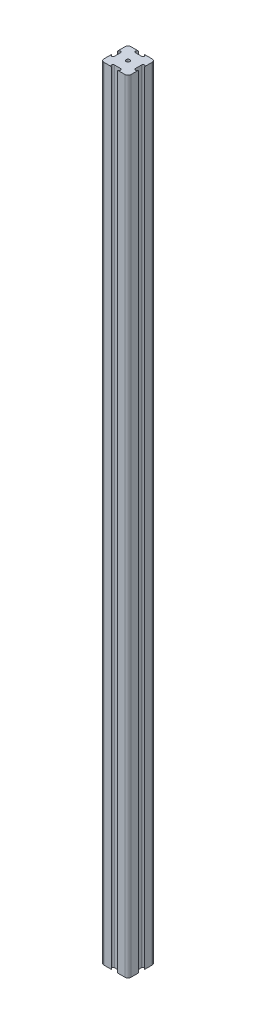
ISO-10303-21;
HEADER;
FILE_DESCRIPTION(('STEP AP214'),'2;1');
FILE_NAME('part.step','',(''),(''),'','','');
FILE_SCHEMA(('AUTOMOTIVE_DESIGN { 1 0 10303 214 1 1 1 1 }'));
ENDSEC;
DATA;
#1=APPLICATION_CONTEXT('core data for automotive mechanical design processes');
#2=APPLICATION_PROTOCOL_DEFINITION('international standard','automotive_design',2000,#1);
#3=PRODUCT_CONTEXT('',#1,'mechanical');
#4=PRODUCT('Part','Part','',(#3));
#5=PRODUCT_RELATED_PRODUCT_CATEGORY('part','',(#4));
#6=PRODUCT_DEFINITION_FORMATION('','',#4);
#7=PRODUCT_DEFINITION_CONTEXT('part definition',#1,'design');
#8=PRODUCT_DEFINITION('design','',#6,#7);
#9=PRODUCT_DEFINITION_SHAPE('','',#8);
#10=(LENGTH_UNIT() NAMED_UNIT(*) SI_UNIT(.MILLI.,.METRE.));
#11=(NAMED_UNIT(*) PLANE_ANGLE_UNIT() SI_UNIT($,.RADIAN.));
#12=(NAMED_UNIT(*) SI_UNIT($,.STERADIAN.) SOLID_ANGLE_UNIT());
#13=UNCERTAINTY_MEASURE_WITH_UNIT(LENGTH_MEASURE(1.E-05),#10,'distance_accuracy_value','');
#14=(GEOMETRIC_REPRESENTATION_CONTEXT(3) GLOBAL_UNCERTAINTY_ASSIGNED_CONTEXT((#13)) GLOBAL_UNIT_ASSIGNED_CONTEXT((#10,
#11,#12)) REPRESENTATION_CONTEXT('',''));
#15=CARTESIAN_POINT('',(0.,0.,0.));
#16=DIRECTION('',(0.,0.,1.));
#17=DIRECTION('',(1.,0.,0.));
#18=AXIS2_PLACEMENT_3D('',#15,#16,#17);
#19=CARTESIAN_POINT('',(-20.,1300.,5.));
#20=DIRECTION('',(0.,-1.,0.));
#21=DIRECTION('',(0.,0.,-1.));
#22=AXIS2_PLACEMENT_3D('',#19,#20,#21);
#23=CYLINDRICAL_SURFACE('',#22,2.5);
#24=CARTESIAN_POINT('',(-20.,0.,5.));
#25=DIRECTION('',(0.,-1.,0.));
#26=DIRECTION('',(0.,0.,-1.));
#27=AXIS2_PLACEMENT_3D('',#24,#25,#26);
#28=CIRCLE('',#27,2.5);
#29=CARTESIAN_POINT('',(-17.5,0.,5.));
#30=VERTEX_POINT('',#29);
#31=CARTESIAN_POINT('',(-22.5,0.,5.));
#32=VERTEX_POINT('',#31);
#33=EDGE_CURVE('E225',#30,#32,#28,.T.);
#34=ORIENTED_EDGE('',*,*,#33,.T.);
#35=DIRECTION('',(0.,-1.,0.));
#36=VECTOR('',#35,1.);
#37=CARTESIAN_POINT('',(-22.5,1300.,5.));
#38=LINE('',#37,#36);
#39=CARTESIAN_POINT('',(-22.5,1300.,5.));
#40=VERTEX_POINT('',#39);
#41=EDGE_CURVE('E11',#40,#32,#38,.T.);
#42=ORIENTED_EDGE('',*,*,#41,.F.);
#43=CARTESIAN_POINT('',(-20.,1300.,5.));
#44=DIRECTION('',(0.,-1.,0.));
#45=DIRECTION('',(0.,0.,-1.));
#46=AXIS2_PLACEMENT_3D('',#43,#44,#45);
#47=CIRCLE('',#46,2.5);
#48=CARTESIAN_POINT('',(-17.5,1300.,5.));
#49=VERTEX_POINT('',#48);
#50=EDGE_CURVE('E290',#49,#40,#47,.T.);
#51=ORIENTED_EDGE('',*,*,#50,.F.);
#52=DIRECTION('',(0.,-1.,0.));
#53=VECTOR('',#52,1.);
#54=CARTESIAN_POINT('',(-17.5,1300.,5.));
#55=LINE('',#54,#53);
#56=EDGE_CURVE('E221',#49,#30,#55,.T.);
#57=ORIENTED_EDGE('',*,*,#56,.T.);
#58=EDGE_LOOP('',(#34,#42,#51,#57));
#59=FACE_BOUND('',#58,.T.);
#60=ADVANCED_FACE('F33',(#59),#23,.F.);
#61=CARTESIAN_POINT('',(-22.5,1300.,5.));
#62=DIRECTION('',(1.,0.,0.));
#63=DIRECTION('',(0.,0.,-1.));
#64=AXIS2_PLACEMENT_3D('',#61,#62,#63);
#65=PLANE('',#64);
#66=DIRECTION('',(0.,0.,1.));
#67=VECTOR('',#66,1.);
#68=CARTESIAN_POINT('',(-22.5,0.,5.));
#69=LINE('',#68,#67);
#70=CARTESIAN_POINT('',(-22.5,0.,17.4999999999999));
#71=VERTEX_POINT('',#70);
#72=EDGE_CURVE('E228',#32,#71,#69,.T.);
#73=ORIENTED_EDGE('',*,*,#72,.T.);
#74=DIRECTION('',(0.,-1.,0.));
#75=VECTOR('',#74,1.);
#76=CARTESIAN_POINT('',(-22.5,1300.,17.4999999999999));
#77=LINE('',#76,#75);
#78=CARTESIAN_POINT('',(-22.5,1300.,17.4999999999999));
#79=VERTEX_POINT('',#78);
#80=EDGE_CURVE('E41',#79,#71,#77,.T.);
#81=ORIENTED_EDGE('',*,*,#80,.F.);
#82=DIRECTION('',(0.,0.,1.));
#83=VECTOR('',#82,1.);
#84=CARTESIAN_POINT('',(-22.5,1300.,5.));
#85=LINE('',#84,#83);
#86=EDGE_CURVE('E136',#40,#79,#85,.T.);
#87=ORIENTED_EDGE('',*,*,#86,.F.);
#88=ORIENTED_EDGE('',*,*,#41,.T.);
#89=EDGE_LOOP('',(#73,#81,#87,#88));
#90=FACE_BOUND('',#89,.T.);
#91=ADVANCED_FACE('F417',(#90),#65,.F.);
#92=CARTESIAN_POINT('',(-17.5,1300.,17.5));
#93=DIRECTION('',(0.,-1.,0.));
#94=DIRECTION('',(0.,0.,-1.));
#95=AXIS2_PLACEMENT_3D('',#92,#93,#94);
#96=CYLINDRICAL_SURFACE('',#95,5.);
#97=CARTESIAN_POINT('',(-17.5,0.,17.5));
#98=DIRECTION('',(0.,1.,0.));
#99=DIRECTION('',(0.,0.,1.));
#100=AXIS2_PLACEMENT_3D('',#97,#98,#99);
#101=CIRCLE('',#100,5.);
#102=CARTESIAN_POINT('',(-17.5,0.,22.5));
#103=VERTEX_POINT('',#102);
#104=EDGE_CURVE('E231',#71,#103,#101,.T.);
#105=ORIENTED_EDGE('',*,*,#104,.T.);
#106=DIRECTION('',(0.,-1.,0.));
#107=VECTOR('',#106,1.);
#108=CARTESIAN_POINT('',(-17.5,1300.,22.5));
#109=LINE('',#108,#107);
#110=CARTESIAN_POINT('',(-17.5,1300.,22.5));
#111=VERTEX_POINT('',#110);
#112=EDGE_CURVE('E329',#111,#103,#109,.T.);
#113=ORIENTED_EDGE('',*,*,#112,.F.);
#114=CARTESIAN_POINT('',(-17.5,1300.,17.5));
#115=DIRECTION('',(0.,1.,0.));
#116=DIRECTION('',(0.,0.,1.));
#117=AXIS2_PLACEMENT_3D('',#114,#115,#116);
#118=CIRCLE('',#117,5.);
#119=EDGE_CURVE('E336',#79,#111,#118,.T.);
#120=ORIENTED_EDGE('',*,*,#119,.F.);
#121=ORIENTED_EDGE('',*,*,#80,.T.);
#122=EDGE_LOOP('',(#105,#113,#120,#121));
#123=FACE_BOUND('',#122,.T.);
#124=ADVANCED_FACE('F334',(#123),#96,.T.);
#125=CARTESIAN_POINT('',(-4.99999999999998,1300.,22.5));
#126=DIRECTION('',(0.,0.,1.));
#127=DIRECTION('',(1.,0.,0.));
#128=AXIS2_PLACEMENT_3D('',#125,#126,#127);
#129=PLANE('',#128);
#130=DIRECTION('',(-1.,0.,0.));
#131=VECTOR('',#130,1.);
#132=CARTESIAN_POINT('',(-4.99999999999998,0.,22.5));
#133=LINE('',#132,#131);
#134=CARTESIAN_POINT('',(-4.99999999999998,0.,22.5));
#135=VERTEX_POINT('',#134);
#136=EDGE_CURVE('E234',#135,#103,#133,.T.);
#137=ORIENTED_EDGE('',*,*,#136,.F.);
#138=DIRECTION('',(0.,-1.,0.));
#139=VECTOR('',#138,1.);
#140=CARTESIAN_POINT('',(-4.99999999999998,1300.,22.5));
#141=LINE('',#140,#139);
#142=CARTESIAN_POINT('',(-4.99999999999998,1300.,22.5));
#143=VERTEX_POINT('',#142);
#144=EDGE_CURVE('E327',#143,#135,#141,.T.);
#145=ORIENTED_EDGE('',*,*,#144,.F.);
#146=DIRECTION('',(-1.,0.,0.));
#147=VECTOR('',#146,1.);
#148=CARTESIAN_POINT('',(-4.99999999999998,1300.,22.5));
#149=LINE('',#148,#147);
#150=EDGE_CURVE('E347',#143,#111,#149,.T.);
#151=ORIENTED_EDGE('',*,*,#150,.T.);
#152=ORIENTED_EDGE('',*,*,#112,.T.);
#153=EDGE_LOOP('',(#137,#145,#151,#152));
#154=FACE_BOUND('',#153,.T.);
#155=ADVANCED_FACE('F344',(#154),#129,.T.);
#156=CARTESIAN_POINT('',(-5.,1300.,20.));
#157=DIRECTION('',(0.,-1.,0.));
#158=DIRECTION('',(0.,0.,-1.));
#159=AXIS2_PLACEMENT_3D('',#156,#157,#158);
#160=CYLINDRICAL_SURFACE('',#159,2.5);
#161=CARTESIAN_POINT('',(-5.,0.,20.));
#162=DIRECTION('',(0.,1.,0.));
#163=DIRECTION('',(0.,0.,1.));
#164=AXIS2_PLACEMENT_3D('',#161,#162,#163);
#165=CIRCLE('',#164,2.5);
#166=CARTESIAN_POINT('',(-4.99999999999998,0.,17.5));
#167=VERTEX_POINT('',#166);
#168=EDGE_CURVE('E237',#167,#135,#165,.T.);
#169=ORIENTED_EDGE('',*,*,#168,.F.);
#170=DIRECTION('',(0.,-1.,0.));
#171=VECTOR('',#170,1.);
#172=CARTESIAN_POINT('',(-4.99999999999998,1300.,17.5));
#173=LINE('',#172,#171);
#174=CARTESIAN_POINT('',(-4.99999999999998,1300.,17.5));
#175=VERTEX_POINT('',#174);
#176=EDGE_CURVE('E325',#175,#167,#173,.T.);
#177=ORIENTED_EDGE('',*,*,#176,.F.);
#178=CARTESIAN_POINT('',(-5.,1300.,20.));
#179=DIRECTION('',(0.,1.,0.));
#180=DIRECTION('',(0.,0.,1.));
#181=AXIS2_PLACEMENT_3D('',#178,#179,#180);
#182=CIRCLE('',#181,2.5);
#183=EDGE_CURVE('E350',#175,#143,#182,.T.);
#184=ORIENTED_EDGE('',*,*,#183,.T.);
#185=ORIENTED_EDGE('',*,*,#144,.T.);
#186=EDGE_LOOP('',(#169,#177,#184,#185));
#187=FACE_BOUND('',#186,.T.);
#188=ADVANCED_FACE('F624',(#187),#160,.F.);
#189=CARTESIAN_POINT('',(-4.99999999999998,1300.,17.5));
#190=DIRECTION('',(0.,0.,-1.));
#191=DIRECTION('',(-1.,0.,0.));
#192=AXIS2_PLACEMENT_3D('',#189,#190,#191);
#193=PLANE('',#192);
#194=DIRECTION('',(1.,0.,0.));
#195=VECTOR('',#194,1.);
#196=CARTESIAN_POINT('',(-4.99999999999998,0.,17.5));
#197=LINE('',#196,#195);
#198=CARTESIAN_POINT('',(5.00000000000002,0.,17.5));
#199=VERTEX_POINT('',#198);
#200=EDGE_CURVE('E240',#167,#199,#197,.T.);
#201=ORIENTED_EDGE('',*,*,#200,.T.);
#202=DIRECTION('',(0.,-1.,0.));
#203=VECTOR('',#202,1.);
#204=CARTESIAN_POINT('',(5.00000000000002,1300.,17.5));
#205=LINE('',#204,#203);
#206=CARTESIAN_POINT('',(5.00000000000002,1300.,17.5));
#207=VERTEX_POINT('',#206);
#208=EDGE_CURVE('E323',#207,#199,#205,.T.);
#209=ORIENTED_EDGE('',*,*,#208,.F.);
#210=DIRECTION('',(1.,0.,0.));
#211=VECTOR('',#210,1.);
#212=CARTESIAN_POINT('',(-4.99999999999998,1300.,17.5));
#213=LINE('',#212,#211);
#214=EDGE_CURVE('E352',#175,#207,#213,.T.);
#215=ORIENTED_EDGE('',*,*,#214,.F.);
#216=ORIENTED_EDGE('',*,*,#176,.T.);
#217=EDGE_LOOP('',(#201,#209,#215,#216));
#218=FACE_BOUND('',#217,.T.);
#219=ADVANCED_FACE('F614',(#218),#193,.F.);
#220=CARTESIAN_POINT('',(4.99999999999996,1300.,20.));
#221=DIRECTION('',(0.,-1.,0.));
#222=DIRECTION('',(0.,0.,-1.));
#223=AXIS2_PLACEMENT_3D('',#220,#221,#222);
#224=CYLINDRICAL_SURFACE('',#223,2.50000000000001);
#225=CARTESIAN_POINT('',(4.99999999999996,0.,20.));
#226=DIRECTION('',(0.,1.,0.));
#227=DIRECTION('',(0.,0.,1.));
#228=AXIS2_PLACEMENT_3D('',#225,#226,#227);
#229=CIRCLE('',#228,2.50000000000001);
#230=CARTESIAN_POINT('',(4.99999999999996,0.,22.5));
#231=VERTEX_POINT('',#230);
#232=EDGE_CURVE('E243',#231,#199,#229,.T.);
#233=ORIENTED_EDGE('',*,*,#232,.F.);
#234=DIRECTION('',(0.,-1.,0.));
#235=VECTOR('',#234,1.);
#236=CARTESIAN_POINT('',(4.99999999999996,1300.,22.5));
#237=LINE('',#236,#235);
#238=CARTESIAN_POINT('',(4.99999999999996,1300.,22.5));
#239=VERTEX_POINT('',#238);
#240=EDGE_CURVE('E321',#239,#231,#237,.T.);
#241=ORIENTED_EDGE('',*,*,#240,.F.);
#242=CARTESIAN_POINT('',(4.99999999999996,1300.,20.));
#243=DIRECTION('',(0.,1.,0.));
#244=DIRECTION('',(0.,0.,1.));
#245=AXIS2_PLACEMENT_3D('',#242,#243,#244);
#246=CIRCLE('',#245,2.50000000000001);
#247=EDGE_CURVE('E358',#239,#207,#246,.T.);
#248=ORIENTED_EDGE('',*,*,#247,.T.);
#249=ORIENTED_EDGE('',*,*,#208,.T.);
#250=EDGE_LOOP('',(#233,#241,#248,#249));
#251=FACE_BOUND('',#250,.T.);
#252=ADVANCED_FACE('F604',(#251),#224,.F.);
#253=CARTESIAN_POINT('',(4.99999999999996,1300.,22.5));
#254=DIRECTION('',(0.,0.,-1.));
#255=DIRECTION('',(-1.,0.,0.));
#256=AXIS2_PLACEMENT_3D('',#253,#254,#255);
#257=PLANE('',#256);
#258=DIRECTION('',(1.,0.,0.));
#259=VECTOR('',#258,1.);
#260=CARTESIAN_POINT('',(4.99999999999996,0.,22.5));
#261=LINE('',#260,#259);
#262=CARTESIAN_POINT('',(17.5,0.,22.5));
#263=VERTEX_POINT('',#262);
#264=EDGE_CURVE('E246',#231,#263,#261,.T.);
#265=ORIENTED_EDGE('',*,*,#264,.T.);
#266=DIRECTION('',(0.,-1.,0.));
#267=VECTOR('',#266,1.);
#268=CARTESIAN_POINT('',(17.5,1300.,22.5));
#269=LINE('',#268,#267);
#270=CARTESIAN_POINT('',(17.5,1300.,22.5));
#271=VERTEX_POINT('',#270);
#272=EDGE_CURVE('E318',#271,#263,#269,.T.);
#273=ORIENTED_EDGE('',*,*,#272,.F.);
#274=DIRECTION('',(1.,0.,0.));
#275=VECTOR('',#274,1.);
#276=CARTESIAN_POINT('',(4.99999999999996,1300.,22.5));
#277=LINE('',#276,#275);
#278=EDGE_CURVE('E361',#239,#271,#277,.T.);
#279=ORIENTED_EDGE('',*,*,#278,.F.);
#280=ORIENTED_EDGE('',*,*,#240,.T.);
#281=EDGE_LOOP('',(#265,#273,#279,#280));
#282=FACE_BOUND('',#281,.T.);
#283=ADVANCED_FACE('F594',(#282),#257,.F.);
#284=CARTESIAN_POINT('',(17.5000000000006,1300.,17.5));
#285=DIRECTION('',(0.,-1.,0.));
#286=DIRECTION('',(0.,0.,-1.));
#287=AXIS2_PLACEMENT_3D('',#284,#285,#286);
#288=CYLINDRICAL_SURFACE('',#287,5.);
#289=CARTESIAN_POINT('',(17.5000000000006,0.,17.5));
#290=DIRECTION('',(0.,1.,0.));
#291=DIRECTION('',(0.,0.,1.));
#292=AXIS2_PLACEMENT_3D('',#289,#290,#291);
#293=CIRCLE('',#292,5.);
#294=CARTESIAN_POINT('',(22.5,0.,17.5000025246919));
#295=VERTEX_POINT('',#294);
#296=EDGE_CURVE('E248',#263,#295,#293,.T.);
#297=ORIENTED_EDGE('',*,*,#296,.T.);
#298=DIRECTION('',(0.,-1.,0.));
#299=VECTOR('',#298,1.);
#300=CARTESIAN_POINT('',(22.5,1300.,17.5000025246919));
#301=LINE('',#300,#299);
#302=CARTESIAN_POINT('',(22.5,1300.,17.5000025246919));
#303=VERTEX_POINT('',#302);
#304=EDGE_CURVE('E316',#303,#295,#301,.T.);
#305=ORIENTED_EDGE('',*,*,#304,.F.);
#306=CARTESIAN_POINT('',(17.5000000000006,1300.,17.5));
#307=DIRECTION('',(0.,1.,0.));
#308=DIRECTION('',(0.,0.,1.));
#309=AXIS2_PLACEMENT_3D('',#306,#307,#308);
#310=CIRCLE('',#309,5.);
#311=EDGE_CURVE('E363',#271,#303,#310,.T.);
#312=ORIENTED_EDGE('',*,*,#311,.F.);
#313=ORIENTED_EDGE('',*,*,#272,.T.);
#314=EDGE_LOOP('',(#297,#305,#312,#313));
#315=FACE_BOUND('',#314,.T.);
#316=ADVANCED_FACE('F584',(#315),#288,.T.);
#317=CARTESIAN_POINT('',(22.5,1300.,5.00000252469196));
#318=DIRECTION('',(1.,0.,0.));
#319=DIRECTION('',(0.,0.,-1.));
#320=AXIS2_PLACEMENT_3D('',#317,#318,#319);
#321=PLANE('',#320);
#322=DIRECTION('',(0.,0.,1.));
#323=VECTOR('',#322,1.);
#324=CARTESIAN_POINT('',(22.5,0.,5.00000252469196));
#325=LINE('',#324,#323);
#326=CARTESIAN_POINT('',(22.5,0.,5.00000252469196));
#327=VERTEX_POINT('',#326);
#328=EDGE_CURVE('E251',#327,#295,#325,.T.);
#329=ORIENTED_EDGE('',*,*,#328,.F.);
#330=DIRECTION('',(0.,-1.,0.));
#331=VECTOR('',#330,1.);
#332=CARTESIAN_POINT('',(22.5,1300.,5.00000252469196));
#333=LINE('',#332,#331);
#334=CARTESIAN_POINT('',(22.5,1300.,5.00000252469196));
#335=VERTEX_POINT('',#334);
#336=EDGE_CURVE('E314',#335,#327,#333,.T.);
#337=ORIENTED_EDGE('',*,*,#336,.F.);
#338=DIRECTION('',(0.,0.,1.));
#339=VECTOR('',#338,1.);
#340=CARTESIAN_POINT('',(22.5,1300.,5.00000252469196));
#341=LINE('',#340,#339);
#342=EDGE_CURVE('E365',#335,#303,#341,.T.);
#343=ORIENTED_EDGE('',*,*,#342,.T.);
#344=ORIENTED_EDGE('',*,*,#304,.T.);
#345=EDGE_LOOP('',(#329,#337,#343,#344));
#346=FACE_BOUND('',#345,.T.);
#347=ADVANCED_FACE('F574',(#346),#321,.T.);
#348=CARTESIAN_POINT('',(20.,1300.,5.00000252469196));
#349=DIRECTION('',(0.,-1.,0.));
#350=DIRECTION('',(0.,0.,-1.));
#351=AXIS2_PLACEMENT_3D('',#348,#349,#350);
#352=CYLINDRICAL_SURFACE('',#351,2.5);
#353=CARTESIAN_POINT('',(20.,0.,5.00000252469196));
#354=DIRECTION('',(0.,-1.,0.));
#355=DIRECTION('',(0.,0.,-1.));
#356=AXIS2_PLACEMENT_3D('',#353,#354,#355);
#357=CIRCLE('',#356,2.5);
#358=CARTESIAN_POINT('',(17.5,0.,5.00000252469196));
#359=VERTEX_POINT('',#358);
#360=EDGE_CURVE('E254',#327,#359,#357,.T.);
#361=ORIENTED_EDGE('',*,*,#360,.T.);
#362=DIRECTION('',(0.,-1.,0.));
#363=VECTOR('',#362,1.);
#364=CARTESIAN_POINT('',(17.5,1300.,5.00000252469196));
#365=LINE('',#364,#363);
#366=CARTESIAN_POINT('',(17.5,1300.,5.00000252469196));
#367=VERTEX_POINT('',#366);
#368=EDGE_CURVE('E312',#367,#359,#365,.T.);
#369=ORIENTED_EDGE('',*,*,#368,.F.);
#370=CARTESIAN_POINT('',(20.,1300.,5.00000252469196));
#371=DIRECTION('',(0.,-1.,0.));
#372=DIRECTION('',(0.,0.,-1.));
#373=AXIS2_PLACEMENT_3D('',#370,#371,#372);
#374=CIRCLE('',#373,2.5);
#375=EDGE_CURVE('E368',#335,#367,#374,.T.);
#376=ORIENTED_EDGE('',*,*,#375,.F.);
#377=ORIENTED_EDGE('',*,*,#336,.T.);
#378=EDGE_LOOP('',(#361,#369,#376,#377));
#379=FACE_BOUND('',#378,.T.);
#380=ADVANCED_FACE('F564',(#379),#352,.F.);
#381=CARTESIAN_POINT('',(17.5,1300.,-4.99999747530804));
#382=DIRECTION('',(1.,0.,0.));
#383=DIRECTION('',(0.,0.,-1.));
#384=AXIS2_PLACEMENT_3D('',#381,#382,#383);
#385=PLANE('',#384);
#386=DIRECTION('',(0.,0.,1.));
#387=VECTOR('',#386,1.);
#388=CARTESIAN_POINT('',(17.5,0.,-4.99999747530804));
#389=LINE('',#388,#387);
#390=CARTESIAN_POINT('',(17.5,0.,-4.99999747530804));
#391=VERTEX_POINT('',#390);
#392=EDGE_CURVE('E257',#391,#359,#389,.T.);
#393=ORIENTED_EDGE('',*,*,#392,.F.);
#394=DIRECTION('',(0.,-1.,0.));
#395=VECTOR('',#394,1.);
#396=CARTESIAN_POINT('',(17.5,1300.,-4.99999747530804));
#397=LINE('',#396,#395);
#398=CARTESIAN_POINT('',(17.5,1300.,-4.99999747530804));
#399=VERTEX_POINT('',#398);
#400=EDGE_CURVE('E310',#399,#391,#397,.T.);
#401=ORIENTED_EDGE('',*,*,#400,.F.);
#402=DIRECTION('',(0.,0.,1.));
#403=VECTOR('',#402,1.);
#404=CARTESIAN_POINT('',(17.5,1300.,-4.99999747530804));
#405=LINE('',#404,#403);
#406=EDGE_CURVE('E370',#399,#367,#405,.T.);
#407=ORIENTED_EDGE('',*,*,#406,.T.);
#408=ORIENTED_EDGE('',*,*,#368,.T.);
#409=EDGE_LOOP('',(#393,#401,#407,#408));
#410=FACE_BOUND('',#409,.T.);
#411=ADVANCED_FACE('F554',(#410),#385,.T.);
#412=CARTESIAN_POINT('',(20.,1300.,-4.99999747530804));
#413=DIRECTION('',(0.,-1.,0.));
#414=DIRECTION('',(0.,0.,-1.));
#415=AXIS2_PLACEMENT_3D('',#412,#413,#414);
#416=CYLINDRICAL_SURFACE('',#415,2.5);
#417=CARTESIAN_POINT('',(20.,0.,-4.99999747530804));
#418=DIRECTION('',(0.,1.,0.));
#419=DIRECTION('',(0.,0.,1.));
#420=AXIS2_PLACEMENT_3D('',#417,#418,#419);
#421=CIRCLE('',#420,2.5);
#422=CARTESIAN_POINT('',(22.5,0.,-4.99999747530804));
#423=VERTEX_POINT('',#422);
#424=EDGE_CURVE('E260',#423,#391,#421,.T.);
#425=ORIENTED_EDGE('',*,*,#424,.F.);
#426=DIRECTION('',(0.,-1.,0.));
#427=VECTOR('',#426,1.);
#428=CARTESIAN_POINT('',(22.5,1300.,-4.99999747530804));
#429=LINE('',#428,#427);
#430=CARTESIAN_POINT('',(22.5,1300.,-4.99999747530804));
#431=VERTEX_POINT('',#430);
#432=EDGE_CURVE('E308',#431,#423,#429,.T.);
#433=ORIENTED_EDGE('',*,*,#432,.F.);
#434=CARTESIAN_POINT('',(20.,1300.,-4.99999747530804));
#435=DIRECTION('',(0.,1.,0.));
#436=DIRECTION('',(0.,0.,1.));
#437=AXIS2_PLACEMENT_3D('',#434,#435,#436);
#438=CIRCLE('',#437,2.5);
#439=EDGE_CURVE('E373',#431,#399,#438,.T.);
#440=ORIENTED_EDGE('',*,*,#439,.T.);
#441=ORIENTED_EDGE('',*,*,#400,.T.);
#442=EDGE_LOOP('',(#425,#433,#440,#441));
#443=FACE_BOUND('',#442,.T.);
#444=ADVANCED_FACE('F544',(#443),#416,.F.);
#445=CARTESIAN_POINT('',(22.5,1300.,-4.99999747530804));
#446=DIRECTION('',(-1.,0.,0.));
#447=DIRECTION('',(0.,0.,1.));
#448=AXIS2_PLACEMENT_3D('',#445,#446,#447);
#449=PLANE('',#448);
#450=DIRECTION('',(0.,0.,-1.));
#451=VECTOR('',#450,1.);
#452=CARTESIAN_POINT('',(22.5,0.,-4.99999747530804));
#453=LINE('',#452,#451);
#454=CARTESIAN_POINT('',(22.5,0.,-17.499997475308));
#455=VERTEX_POINT('',#454);
#456=EDGE_CURVE('E263',#423,#455,#453,.T.);
#457=ORIENTED_EDGE('',*,*,#456,.T.);
#458=DIRECTION('',(0.,-1.,0.));
#459=VECTOR('',#458,1.);
#460=CARTESIAN_POINT('',(22.5,1300.,-17.499997475308));
#461=LINE('',#460,#459);
#462=CARTESIAN_POINT('',(22.5,1300.,-17.499997475308));
#463=VERTEX_POINT('',#462);
#464=EDGE_CURVE('E306',#463,#455,#461,.T.);
#465=ORIENTED_EDGE('',*,*,#464,.F.);
#466=DIRECTION('',(0.,0.,-1.));
#467=VECTOR('',#466,1.);
#468=CARTESIAN_POINT('',(22.5,1300.,-4.99999747530804));
#469=LINE('',#468,#467);
#470=EDGE_CURVE('E376',#431,#463,#469,.T.);
#471=ORIENTED_EDGE('',*,*,#470,.F.);
#472=ORIENTED_EDGE('',*,*,#432,.T.);
#473=EDGE_LOOP('',(#457,#465,#471,#472));
#474=FACE_BOUND('',#473,.T.);
#475=ADVANCED_FACE('F534',(#474),#449,.F.);
#476=CARTESIAN_POINT('',(17.5000000000006,1300.,-17.5));
#477=DIRECTION('',(0.,-1.,0.));
#478=DIRECTION('',(0.,0.,-1.));
#479=AXIS2_PLACEMENT_3D('',#476,#477,#478);
#480=CYLINDRICAL_SURFACE('',#479,5.00000000000001);
#481=CARTESIAN_POINT('',(17.5000000000006,0.,-17.5));
#482=DIRECTION('',(0.,-1.,0.));
#483=DIRECTION('',(0.,0.,-1.));
#484=AXIS2_PLACEMENT_3D('',#481,#482,#483);
#485=CIRCLE('',#484,5.00000000000001);
#486=CARTESIAN_POINT('',(17.5,0.,-22.5));
#487=VERTEX_POINT('',#486);
#488=EDGE_CURVE('E266',#487,#455,#485,.T.);
#489=ORIENTED_EDGE('',*,*,#488,.F.);
#490=DIRECTION('',(0.,-1.,0.));
#491=VECTOR('',#490,1.);
#492=CARTESIAN_POINT('',(17.5,1300.,-22.5));
#493=LINE('',#492,#491);
#494=CARTESIAN_POINT('',(17.5,1300.,-22.5));
#495=VERTEX_POINT('',#494);
#496=EDGE_CURVE('E304',#495,#487,#493,.T.);
#497=ORIENTED_EDGE('',*,*,#496,.F.);
#498=CARTESIAN_POINT('',(17.5000000000006,1300.,-17.5));
#499=DIRECTION('',(0.,-1.,0.));
#500=DIRECTION('',(0.,0.,-1.));
#501=AXIS2_PLACEMENT_3D('',#498,#499,#500);
#502=CIRCLE('',#501,5.00000000000001);
#503=EDGE_CURVE('E378',#495,#463,#502,.T.);
#504=ORIENTED_EDGE('',*,*,#503,.T.);
#505=ORIENTED_EDGE('',*,*,#464,.T.);
#506=EDGE_LOOP('',(#489,#497,#504,#505));
#507=FACE_BOUND('',#506,.T.);
#508=ADVANCED_FACE('F524',(#507),#480,.T.);
#509=CARTESIAN_POINT('',(5.00000000000003,1300.,-22.5));
#510=DIRECTION('',(0.,0.,-1.));
#511=DIRECTION('',(-1.,0.,0.));
#512=AXIS2_PLACEMENT_3D('',#509,#510,#511);
#513=PLANE('',#512);
#514=DIRECTION('',(1.,0.,0.));
#515=VECTOR('',#514,1.);
#516=CARTESIAN_POINT('',(5.00000000000003,0.,-22.5));
#517=LINE('',#516,#515);
#518=CARTESIAN_POINT('',(5.00000000000003,0.,-22.5));
#519=VERTEX_POINT('',#518);
#520=EDGE_CURVE('E269',#519,#487,#517,.T.);
#521=ORIENTED_EDGE('',*,*,#520,.F.);
#522=DIRECTION('',(0.,-1.,0.));
#523=VECTOR('',#522,1.);
#524=CARTESIAN_POINT('',(5.00000000000003,1300.,-22.5));
#525=LINE('',#524,#523);
#526=CARTESIAN_POINT('',(5.00000000000003,1300.,-22.5));
#527=VERTEX_POINT('',#526);
#528=EDGE_CURVE('E302',#527,#519,#525,.T.);
#529=ORIENTED_EDGE('',*,*,#528,.F.);
#530=DIRECTION('',(1.,0.,0.));
#531=VECTOR('',#530,1.);
#532=CARTESIAN_POINT('',(5.00000000000003,1300.,-22.5));
#533=LINE('',#532,#531);
#534=EDGE_CURVE('E381',#527,#495,#533,.T.);
#535=ORIENTED_EDGE('',*,*,#534,.T.);
#536=ORIENTED_EDGE('',*,*,#496,.T.);
#537=EDGE_LOOP('',(#521,#529,#535,#536));
#538=FACE_BOUND('',#537,.T.);
#539=ADVANCED_FACE('F514',(#538),#513,.T.);
#540=CARTESIAN_POINT('',(5.00000000000003,1300.,-20.));
#541=DIRECTION('',(0.,-1.,0.));
#542=DIRECTION('',(0.,0.,-1.));
#543=AXIS2_PLACEMENT_3D('',#540,#541,#542);
#544=CYLINDRICAL_SURFACE('',#543,2.50000000000001);
#545=CARTESIAN_POINT('',(5.00000000000003,0.,-20.));
#546=DIRECTION('',(0.,1.,0.));
#547=DIRECTION('',(0.,0.,1.));
#548=AXIS2_PLACEMENT_3D('',#545,#546,#547);
#549=CIRCLE('',#548,2.50000000000001);
#550=CARTESIAN_POINT('',(5.00000000000001,0.,-17.5));
#551=VERTEX_POINT('',#550);
#552=EDGE_CURVE('E272',#551,#519,#549,.T.);
#553=ORIENTED_EDGE('',*,*,#552,.F.);
#554=DIRECTION('',(0.,-1.,0.));
#555=VECTOR('',#554,1.);
#556=CARTESIAN_POINT('',(5.00000000000001,1300.,-17.5));
#557=LINE('',#556,#555);
#558=CARTESIAN_POINT('',(5.00000000000001,1300.,-17.5));
#559=VERTEX_POINT('',#558);
#560=EDGE_CURVE('E300',#559,#551,#557,.T.);
#561=ORIENTED_EDGE('',*,*,#560,.F.);
#562=CARTESIAN_POINT('',(5.00000000000003,1300.,-20.));
#563=DIRECTION('',(0.,1.,0.));
#564=DIRECTION('',(0.,0.,1.));
#565=AXIS2_PLACEMENT_3D('',#562,#563,#564);
#566=CIRCLE('',#565,2.50000000000001);
#567=EDGE_CURVE('E384',#559,#527,#566,.T.);
#568=ORIENTED_EDGE('',*,*,#567,.T.);
#569=ORIENTED_EDGE('',*,*,#528,.T.);
#570=EDGE_LOOP('',(#553,#561,#568,#569));
#571=FACE_BOUND('',#570,.T.);
#572=ADVANCED_FACE('F504',(#571),#544,.F.);
#573=CARTESIAN_POINT('',(-5.,1300.,-17.5));
#574=DIRECTION('',(0.,0.,-1.));
#575=DIRECTION('',(-1.,0.,0.));
#576=AXIS2_PLACEMENT_3D('',#573,#574,#575);
#577=PLANE('',#576);
#578=DIRECTION('',(1.,0.,0.));
#579=VECTOR('',#578,1.);
#580=CARTESIAN_POINT('',(-5.,0.,-17.5));
#581=LINE('',#580,#579);
#582=CARTESIAN_POINT('',(-5.,0.,-17.5));
#583=VERTEX_POINT('',#582);
#584=EDGE_CURVE('E275',#583,#551,#581,.T.);
#585=ORIENTED_EDGE('',*,*,#584,.F.);
#586=DIRECTION('',(0.,-1.,0.));
#587=VECTOR('',#586,1.);
#588=CARTESIAN_POINT('',(-5.,1300.,-17.5));
#589=LINE('',#588,#587);
#590=CARTESIAN_POINT('',(-5.,1300.,-17.5));
#591=VERTEX_POINT('',#590);
#592=EDGE_CURVE('E298',#591,#583,#589,.T.);
#593=ORIENTED_EDGE('',*,*,#592,.F.);
#594=DIRECTION('',(1.,0.,0.));
#595=VECTOR('',#594,1.);
#596=CARTESIAN_POINT('',(-5.,1300.,-17.5));
#597=LINE('',#596,#595);
#598=EDGE_CURVE('E387',#591,#559,#597,.T.);
#599=ORIENTED_EDGE('',*,*,#598,.T.);
#600=ORIENTED_EDGE('',*,*,#560,.T.);
#601=EDGE_LOOP('',(#585,#593,#599,#600));
#602=FACE_BOUND('',#601,.T.);
#603=ADVANCED_FACE('F495',(#602),#577,.T.);
#604=CARTESIAN_POINT('',(-5.00000000000003,1300.,-20.));
#605=DIRECTION('',(0.,-1.,0.));
#606=DIRECTION('',(0.,0.,-1.));
#607=AXIS2_PLACEMENT_3D('',#604,#605,#606);
#608=CYLINDRICAL_SURFACE('',#607,2.5);
#609=CARTESIAN_POINT('',(-5.00000000000003,0.,-20.));
#610=DIRECTION('',(0.,1.,0.));
#611=DIRECTION('',(0.,0.,1.));
#612=AXIS2_PLACEMENT_3D('',#609,#610,#611);
#613=CIRCLE('',#612,2.5);
#614=CARTESIAN_POINT('',(-5.00000000000003,0.,-22.5));
#615=VERTEX_POINT('',#614);
#616=EDGE_CURVE('E278',#615,#583,#613,.T.);
#617=ORIENTED_EDGE('',*,*,#616,.F.);
#618=DIRECTION('',(0.,-1.,0.));
#619=VECTOR('',#618,1.);
#620=CARTESIAN_POINT('',(-5.00000000000003,1300.,-22.5));
#621=LINE('',#620,#619);
#622=CARTESIAN_POINT('',(-5.00000000000003,1300.,-22.5));
#623=VERTEX_POINT('',#622);
#624=EDGE_CURVE('E296',#623,#615,#621,.T.);
#625=ORIENTED_EDGE('',*,*,#624,.F.);
#626=CARTESIAN_POINT('',(-5.00000000000003,1300.,-20.));
#627=DIRECTION('',(0.,1.,0.));
#628=DIRECTION('',(0.,0.,1.));
#629=AXIS2_PLACEMENT_3D('',#626,#627,#628);
#630=CIRCLE('',#629,2.5);
#631=EDGE_CURVE('E390',#623,#591,#630,.T.);
#632=ORIENTED_EDGE('',*,*,#631,.T.);
#633=ORIENTED_EDGE('',*,*,#592,.T.);
#634=EDGE_LOOP('',(#617,#625,#632,#633));
#635=FACE_BOUND('',#634,.T.);
#636=ADVANCED_FACE('F403',(#635),#608,.F.);
#637=CARTESIAN_POINT('',(-17.5,1300.,-22.5));
#638=DIRECTION('',(0.,0.,-1.));
#639=DIRECTION('',(-1.,0.,0.));
#640=AXIS2_PLACEMENT_3D('',#637,#638,#639);
#641=PLANE('',#640);
#642=DIRECTION('',(1.,0.,0.));
#643=VECTOR('',#642,1.);
#644=CARTESIAN_POINT('',(-17.5,0.,-22.5));
#645=LINE('',#644,#643);
#646=CARTESIAN_POINT('',(-17.5,0.,-22.5));
#647=VERTEX_POINT('',#646);
#648=EDGE_CURVE('E281',#647,#615,#645,.T.);
#649=ORIENTED_EDGE('',*,*,#648,.F.);
#650=DIRECTION('',(0.,-1.,0.));
#651=VECTOR('',#650,1.);
#652=CARTESIAN_POINT('',(-17.5,1300.,-22.5));
#653=LINE('',#652,#651);
#654=CARTESIAN_POINT('',(-17.5,1300.,-22.5));
#655=VERTEX_POINT('',#654);
#656=EDGE_CURVE('E294',#655,#647,#653,.T.);
#657=ORIENTED_EDGE('',*,*,#656,.F.);
#658=DIRECTION('',(1.,0.,0.));
#659=VECTOR('',#658,1.);
#660=CARTESIAN_POINT('',(-17.5,1300.,-22.5));
#661=LINE('',#660,#659);
#662=EDGE_CURVE('E393',#655,#623,#661,.T.);
#663=ORIENTED_EDGE('',*,*,#662,.T.);
#664=ORIENTED_EDGE('',*,*,#624,.T.);
#665=EDGE_LOOP('',(#649,#657,#663,#664));
#666=FACE_BOUND('',#665,.T.);
#667=ADVANCED_FACE('F397',(#666),#641,.T.);
#668=CARTESIAN_POINT('',(-17.5,1300.,-17.5));
#669=DIRECTION('',(0.,-1.,0.));
#670=DIRECTION('',(0.,0.,-1.));
#671=AXIS2_PLACEMENT_3D('',#668,#669,#670);
#672=CYLINDRICAL_SURFACE('',#671,5.00000000000001);
#673=CARTESIAN_POINT('',(-17.5,0.,-17.5));
#674=DIRECTION('',(0.,1.,0.));
#675=DIRECTION('',(0.,0.,1.));
#676=AXIS2_PLACEMENT_3D('',#673,#674,#675);
#677=CIRCLE('',#676,5.00000000000001);
#678=CARTESIAN_POINT('',(-22.5,0.,-17.5));
#679=VERTEX_POINT('',#678);
#680=EDGE_CURVE('E284',#647,#679,#677,.T.);
#681=ORIENTED_EDGE('',*,*,#680,.T.);
#682=DIRECTION('',(0.,-1.,0.));
#683=VECTOR('',#682,1.);
#684=CARTESIAN_POINT('',(-22.5,1300.,-17.5));
#685=LINE('',#684,#683);
#686=CARTESIAN_POINT('',(-22.5,1300.,-17.5));
#687=VERTEX_POINT('',#686);
#688=EDGE_CURVE('E217',#687,#679,#685,.T.);
#689=ORIENTED_EDGE('',*,*,#688,.F.);
#690=CARTESIAN_POINT('',(-17.5,1300.,-17.5));
#691=DIRECTION('',(0.,1.,0.));
#692=DIRECTION('',(0.,0.,1.));
#693=AXIS2_PLACEMENT_3D('',#690,#691,#692);
#694=CIRCLE('',#693,5.00000000000001);
#695=EDGE_CURVE('E204',#655,#687,#694,.T.);
#696=ORIENTED_EDGE('',*,*,#695,.F.);
#697=ORIENTED_EDGE('',*,*,#656,.T.);
#698=EDGE_LOOP('',(#681,#689,#696,#697));
#699=FACE_BOUND('',#698,.T.);
#700=ADVANCED_FACE('F407',(#699),#672,.T.);
#701=CARTESIAN_POINT('',(-22.5,1300.,-17.5));
#702=DIRECTION('',(1.,0.,0.));
#703=DIRECTION('',(0.,0.,-1.));
#704=AXIS2_PLACEMENT_3D('',#701,#702,#703);
#705=PLANE('',#704);
#706=DIRECTION('',(0.,0.,1.));
#707=VECTOR('',#706,1.);
#708=CARTESIAN_POINT('',(-22.5,0.,-17.5));
#709=LINE('',#708,#707);
#710=CARTESIAN_POINT('',(-22.5,0.,-5.));
#711=VERTEX_POINT('',#710);
#712=EDGE_CURVE('E213',#679,#711,#709,.T.);
#713=ORIENTED_EDGE('',*,*,#712,.T.);
#714=DIRECTION('',(0.,-1.,0.));
#715=VECTOR('',#714,1.);
#716=CARTESIAN_POINT('',(-22.5,1300.,-5.));
#717=LINE('',#716,#715);
#718=CARTESIAN_POINT('',(-22.5,1300.,-5.));
#719=VERTEX_POINT('',#718);
#720=EDGE_CURVE('E210',#719,#711,#717,.T.);
#721=ORIENTED_EDGE('',*,*,#720,.F.);
#722=DIRECTION('',(0.,0.,1.));
#723=VECTOR('',#722,1.);
#724=CARTESIAN_POINT('',(-22.5,1300.,-17.5));
#725=LINE('',#724,#723);
#726=EDGE_CURVE('E197',#687,#719,#725,.T.);
#727=ORIENTED_EDGE('',*,*,#726,.F.);
#728=ORIENTED_EDGE('',*,*,#688,.T.);
#729=EDGE_LOOP('',(#713,#721,#727,#728));
#730=FACE_BOUND('',#729,.T.);
#731=ADVANCED_FACE('F211',(#730),#705,.F.);
#732=CARTESIAN_POINT('',(-20.,1300.,-5.));
#733=DIRECTION('',(0.,-1.,0.));
#734=DIRECTION('',(0.,0.,-1.));
#735=AXIS2_PLACEMENT_3D('',#732,#733,#734);
#736=CYLINDRICAL_SURFACE('',#735,2.5);
#737=CARTESIAN_POINT('',(-20.,0.,-5.));
#738=DIRECTION('',(0.,1.,0.));
#739=DIRECTION('',(0.,0.,1.));
#740=AXIS2_PLACEMENT_3D('',#737,#738,#739);
#741=CIRCLE('',#740,2.5);
#742=CARTESIAN_POINT('',(-17.5,0.,-5.));
#743=VERTEX_POINT('',#742);
#744=EDGE_CURVE('E287',#743,#711,#741,.T.);
#745=ORIENTED_EDGE('',*,*,#744,.F.);
#746=DIRECTION('',(0.,-1.,0.));
#747=VECTOR('',#746,1.);
#748=CARTESIAN_POINT('',(-17.5,1300.,-5.));
#749=LINE('',#748,#747);
#750=CARTESIAN_POINT('',(-17.5,1300.,-5.));
#751=VERTEX_POINT('',#750);
#752=EDGE_CURVE('E125',#751,#743,#749,.T.);
#753=ORIENTED_EDGE('',*,*,#752,.F.);
#754=CARTESIAN_POINT('',(-20.,1300.,-5.));
#755=DIRECTION('',(0.,1.,0.));
#756=DIRECTION('',(0.,0.,1.));
#757=AXIS2_PLACEMENT_3D('',#754,#755,#756);
#758=CIRCLE('',#757,2.5);
#759=EDGE_CURVE('E201',#751,#719,#758,.T.);
#760=ORIENTED_EDGE('',*,*,#759,.T.);
#761=ORIENTED_EDGE('',*,*,#720,.T.);
#762=EDGE_LOOP('',(#745,#753,#760,#761));
#763=FACE_BOUND('',#762,.T.);
#764=ADVANCED_FACE('F219',(#763),#736,.F.);
#765=CARTESIAN_POINT('',(-17.5,1300.,-5.));
#766=DIRECTION('',(1.,0.,0.));
#767=DIRECTION('',(0.,0.,-1.));
#768=AXIS2_PLACEMENT_3D('',#765,#766,#767);
#769=PLANE('',#768);
#770=DIRECTION('',(0.,0.,1.));
#771=VECTOR('',#770,1.);
#772=CARTESIAN_POINT('',(-17.5,0.,-5.));
#773=LINE('',#772,#771);
#774=EDGE_CURVE('E128',#743,#30,#773,.T.);
#775=ORIENTED_EDGE('',*,*,#774,.T.);
#776=ORIENTED_EDGE('',*,*,#56,.F.);
#777=DIRECTION('',(0.,0.,1.));
#778=VECTOR('',#777,1.);
#779=CARTESIAN_POINT('',(-17.5,1300.,-5.));
#780=LINE('',#779,#778);
#781=EDGE_CURVE('E49',#751,#49,#780,.T.);
#782=ORIENTED_EDGE('',*,*,#781,.F.);
#783=ORIENTED_EDGE('',*,*,#752,.T.);
#784=EDGE_LOOP('',(#775,#776,#782,#783));
#785=FACE_BOUND('',#784,.T.);
#786=ADVANCED_FACE('F424',(#785),#769,.F.);
#787=CARTESIAN_POINT('',(-20.,1300.,5.));
#788=DIRECTION('',(0.,-1.,0.));
#789=DIRECTION('',(0.,0.,-1.));
#790=AXIS2_PLACEMENT_3D('',#787,#788,#789);
#791=PLANE('',#790);
#792=CARTESIAN_POINT('',(0.,1300.,0.));
#793=DIRECTION('',(0.,-1.,0.));
#794=DIRECTION('',(0.,0.,-1.));
#795=AXIS2_PLACEMENT_3D('',#792,#793,#794);
#796=CIRCLE('',#795,3.);
#797=CARTESIAN_POINT('',(0.,1300.,-3.));
#798=VERTEX_POINT('',#797);
#799=EDGE_CURVE('E229',#798,#798,#796,.T.);
#800=ORIENTED_EDGE('',*,*,#799,.T.);
#801=EDGE_LOOP('',(#800));
#802=FACE_BOUND('',#801,.T.);
#803=ORIENTED_EDGE('',*,*,#50,.T.);
#804=ORIENTED_EDGE('',*,*,#86,.T.);
#805=ORIENTED_EDGE('',*,*,#119,.T.);
#806=ORIENTED_EDGE('',*,*,#150,.F.);
#807=ORIENTED_EDGE('',*,*,#183,.F.);
#808=ORIENTED_EDGE('',*,*,#214,.T.);
#809=ORIENTED_EDGE('',*,*,#247,.F.);
#810=ORIENTED_EDGE('',*,*,#278,.T.);
#811=ORIENTED_EDGE('',*,*,#311,.T.);
#812=ORIENTED_EDGE('',*,*,#342,.F.);
#813=ORIENTED_EDGE('',*,*,#375,.T.);
#814=ORIENTED_EDGE('',*,*,#406,.F.);
#815=ORIENTED_EDGE('',*,*,#439,.F.);
#816=ORIENTED_EDGE('',*,*,#470,.T.);
#817=ORIENTED_EDGE('',*,*,#503,.F.);
#818=ORIENTED_EDGE('',*,*,#534,.F.);
#819=ORIENTED_EDGE('',*,*,#567,.F.);
#820=ORIENTED_EDGE('',*,*,#598,.F.);
#821=ORIENTED_EDGE('',*,*,#631,.F.);
#822=ORIENTED_EDGE('',*,*,#662,.F.);
#823=ORIENTED_EDGE('',*,*,#695,.T.);
#824=ORIENTED_EDGE('',*,*,#726,.T.);
#825=ORIENTED_EDGE('',*,*,#759,.F.);
#826=ORIENTED_EDGE('',*,*,#781,.T.);
#827=EDGE_LOOP('',(#803,#804,#805,#806,#807,#808,#809,#810,#811,#812,#813,#814,#815,#816,#817,
#818,#819,#820,#821,#822,#823,#824,#825,#826));
#828=FACE_BOUND('',#827,.T.);
#829=ADVANCED_FACE('F199',(#802,#828),#791,.F.);
#830=CARTESIAN_POINT('',(-20.,0.,5.));
#831=DIRECTION('',(0.,-1.,0.));
#832=DIRECTION('',(0.,0.,-1.));
#833=AXIS2_PLACEMENT_3D('',#830,#831,#832);
#834=PLANE('',#833);
#835=CARTESIAN_POINT('',(0.,0.,0.));
#836=DIRECTION('',(0.,-1.,0.));
#837=DIRECTION('',(0.,0.,-1.));
#838=AXIS2_PLACEMENT_3D('',#835,#836,#837);
#839=CIRCLE('',#838,3.);
#840=CARTESIAN_POINT('',(0.,0.,-3.));
#841=VERTEX_POINT('',#840);
#842=EDGE_CURVE('E448',#841,#841,#839,.T.);
#843=ORIENTED_EDGE('',*,*,#842,.F.);
#844=EDGE_LOOP('',(#843));
#845=FACE_BOUND('',#844,.T.);
#846=ORIENTED_EDGE('',*,*,#33,.F.);
#847=ORIENTED_EDGE('',*,*,#774,.F.);
#848=ORIENTED_EDGE('',*,*,#744,.T.);
#849=ORIENTED_EDGE('',*,*,#712,.F.);
#850=ORIENTED_EDGE('',*,*,#680,.F.);
#851=ORIENTED_EDGE('',*,*,#648,.T.);
#852=ORIENTED_EDGE('',*,*,#616,.T.);
#853=ORIENTED_EDGE('',*,*,#584,.T.);
#854=ORIENTED_EDGE('',*,*,#552,.T.);
#855=ORIENTED_EDGE('',*,*,#520,.T.);
#856=ORIENTED_EDGE('',*,*,#488,.T.);
#857=ORIENTED_EDGE('',*,*,#456,.F.);
#858=ORIENTED_EDGE('',*,*,#424,.T.);
#859=ORIENTED_EDGE('',*,*,#392,.T.);
#860=ORIENTED_EDGE('',*,*,#360,.F.);
#861=ORIENTED_EDGE('',*,*,#328,.T.);
#862=ORIENTED_EDGE('',*,*,#296,.F.);
#863=ORIENTED_EDGE('',*,*,#264,.F.);
#864=ORIENTED_EDGE('',*,*,#232,.T.);
#865=ORIENTED_EDGE('',*,*,#200,.F.);
#866=ORIENTED_EDGE('',*,*,#168,.T.);
#867=ORIENTED_EDGE('',*,*,#136,.T.);
#868=ORIENTED_EDGE('',*,*,#104,.F.);
#869=ORIENTED_EDGE('',*,*,#72,.F.);
#870=EDGE_LOOP('',(#846,#847,#848,#849,#850,#851,#852,#853,#854,#855,#856,#857,#858,#859,#860,
#861,#862,#863,#864,#865,#866,#867,#868,#869));
#871=FACE_BOUND('',#870,.T.);
#872=ADVANCED_FACE('F339',(#845,#871),#834,.T.);
#873=CARTESIAN_POINT('',(0.,1300.,0.));
#874=DIRECTION('',(0.,-1.,0.));
#875=DIRECTION('',(0.,0.,-1.));
#876=AXIS2_PLACEMENT_3D('',#873,#874,#875);
#877=CYLINDRICAL_SURFACE('',#876,3.);
#878=ORIENTED_EDGE('',*,*,#799,.F.);
#879=EDGE_LOOP('',(#878));
#880=FACE_BOUND('',#879,.T.);
#881=ORIENTED_EDGE('',*,*,#842,.T.);
#882=EDGE_LOOP('',(#881));
#883=FACE_BOUND('',#882,.T.);
#884=ADVANCED_FACE('F436',(#880,#883),#877,.F.);
#885=CLOSED_SHELL('',(#60,#91,#124,#155,#188,#219,#252,#283,#316,#347,#380,#411,#444,#475,#508,
#539,#572,#603,#636,#667,#700,#731,#764,#786,#829,#872,#884));
#886=MANIFOLD_SOLID_BREP('B2',#885);
#887=ADVANCED_BREP_SHAPE_REPRESENTATION('',(#18,#886),#14);
#888=SHAPE_DEFINITION_REPRESENTATION(#9,#887);
ENDSEC;
END-ISO-10303-21;
